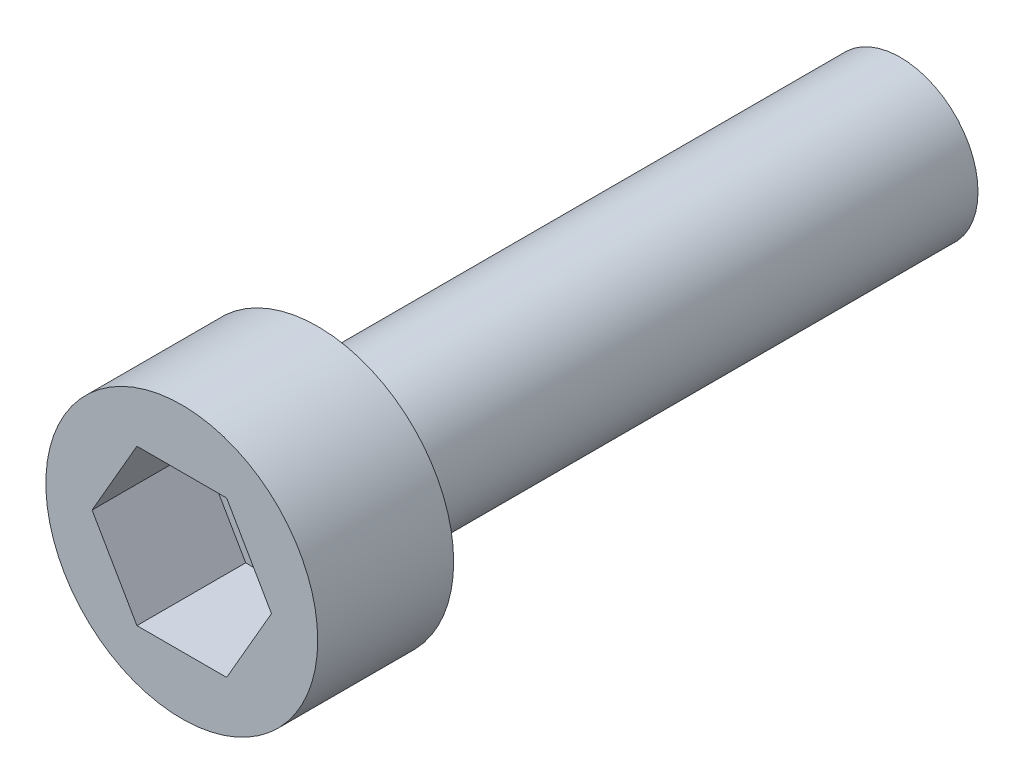
ISO-10303-21;
HEADER;
FILE_DESCRIPTION(('STEP AP214'),'2;1');
FILE_NAME('part.step','',(''),(''),'','','');
FILE_SCHEMA(('AUTOMOTIVE_DESIGN { 1 0 10303 214 1 1 1 1 }'));
ENDSEC;
DATA;
#1=APPLICATION_CONTEXT('core data for automotive mechanical design processes');
#2=APPLICATION_PROTOCOL_DEFINITION('international standard','automotive_design',2000,#1);
#3=PRODUCT_CONTEXT('',#1,'mechanical');
#4=PRODUCT('Part','Part','',(#3));
#5=PRODUCT_RELATED_PRODUCT_CATEGORY('part','',(#4));
#6=PRODUCT_DEFINITION_FORMATION('','',#4);
#7=PRODUCT_DEFINITION_CONTEXT('part definition',#1,'design');
#8=PRODUCT_DEFINITION('design','',#6,#7);
#9=PRODUCT_DEFINITION_SHAPE('','',#8);
#10=(LENGTH_UNIT() NAMED_UNIT(*) SI_UNIT(.MILLI.,.METRE.));
#11=(NAMED_UNIT(*) PLANE_ANGLE_UNIT() SI_UNIT($,.RADIAN.));
#12=(NAMED_UNIT(*) SI_UNIT($,.STERADIAN.) SOLID_ANGLE_UNIT());
#13=UNCERTAINTY_MEASURE_WITH_UNIT(LENGTH_MEASURE(1.E-05),#10,'distance_accuracy_value','');
#14=(GEOMETRIC_REPRESENTATION_CONTEXT(3) GLOBAL_UNCERTAINTY_ASSIGNED_CONTEXT((#13)) GLOBAL_UNIT_ASSIGNED_CONTEXT((#10,
#11,#12)) REPRESENTATION_CONTEXT('',''));
#15=CARTESIAN_POINT('',(0.,0.,0.));
#16=DIRECTION('',(0.,0.,1.));
#17=DIRECTION('',(1.,0.,0.));
#18=AXIS2_PLACEMENT_3D('',#15,#16,#17);
#19=CARTESIAN_POINT('',(0.,0.,3.5));
#20=DIRECTION('',(0.,0.,-1.));
#21=DIRECTION('',(-1.,0.,0.));
#22=AXIS2_PLACEMENT_3D('',#19,#20,#21);
#23=CYLINDRICAL_SURFACE('',#22,3.5);
#24=CARTESIAN_POINT('',(0.,0.,3.5));
#25=DIRECTION('',(0.,0.,1.));
#26=DIRECTION('',(1.,0.,0.));
#27=AXIS2_PLACEMENT_3D('',#24,#25,#26);
#28=CIRCLE('',#27,3.5);
#29=CARTESIAN_POINT('',(3.5,0.,3.5));
#30=VERTEX_POINT('',#29);
#31=EDGE_CURVE('E11',#30,#30,#28,.T.);
#32=ORIENTED_EDGE('',*,*,#31,.F.);
#33=EDGE_LOOP('',(#32));
#34=FACE_BOUND('',#33,.T.);
#35=CARTESIAN_POINT('',(0.,0.,0.));
#36=DIRECTION('',(0.,0.,1.));
#37=DIRECTION('',(1.,0.,0.));
#38=AXIS2_PLACEMENT_3D('',#35,#36,#37);
#39=CIRCLE('',#38,3.5);
#40=CARTESIAN_POINT('',(3.5,0.,0.));
#41=VERTEX_POINT('',#40);
#42=EDGE_CURVE('E36',#41,#41,#39,.T.);
#43=ORIENTED_EDGE('',*,*,#42,.T.);
#44=EDGE_LOOP('',(#43));
#45=FACE_BOUND('',#44,.T.);
#46=ADVANCED_FACE('F33',(#34,#45),#23,.T.);
#47=CARTESIAN_POINT('',(0.,0.,3.5));
#48=DIRECTION('',(0.,0.,1.));
#49=DIRECTION('',(1.,0.,0.));
#50=AXIS2_PLACEMENT_3D('',#47,#48,#49);
#51=PLANE('',#50);
#52=DIRECTION('',(-0.499999999999528,-0.866025403784711,0.));
#53=VECTOR('',#52,1.);
#54=CARTESIAN_POINT('',(-2.30940107675726,2.46370163389215E-12,3.5));
#55=LINE('',#54,#53);
#56=CARTESIAN_POINT('',(-1.1547005383805,2.00000000000066,3.5));
#57=VERTEX_POINT('',#56);
#58=CARTESIAN_POINT('',(-2.30940107675726,2.46352417632156E-12,3.5));
#59=VERTEX_POINT('',#58);
#60=EDGE_CURVE('E47',#57,#59,#55,.T.);
#61=ORIENTED_EDGE('',*,*,#60,.F.);
#62=DIRECTION('',(-1.,-7.11158173176407E-13,0.));
#63=VECTOR('',#62,1.);
#64=CARTESIAN_POINT('',(-1.1547005383805,2.00000000000066,3.5));
#65=LINE('',#64,#63);
#66=CARTESIAN_POINT('',(1.15470053838058,2.00000000000231,3.5));
#67=VERTEX_POINT('',#66);
#68=EDGE_CURVE('E131',#67,#57,#65,.T.);
#69=ORIENTED_EDGE('',*,*,#68,.F.);
#70=DIRECTION('',(-0.500000000000431,0.86602540378419,0.));
#71=VECTOR('',#70,1.);
#72=CARTESIAN_POINT('',(1.15470053838058,2.00000000000231,3.5));
#73=LINE('',#72,#71);
#74=CARTESIAN_POINT('',(2.30940107676107,2.46370163389218E-12,3.5));
#75=VERTEX_POINT('',#74);
#76=EDGE_CURVE('E129',#75,#67,#73,.T.);
#77=ORIENTED_EDGE('',*,*,#76,.F.);
#78=DIRECTION('',(0.499999999999528,0.866025403784711,0.));
#79=VECTOR('',#78,1.);
#80=CARTESIAN_POINT('',(2.30940107676107,2.46370163389218E-12,3.5));
#81=LINE('',#80,#79);
#82=CARTESIAN_POINT('',(1.15470053838058,-2.00000000000219,3.5));
#83=VERTEX_POINT('',#82);
#84=EDGE_CURVE('E95',#83,#75,#81,.T.);
#85=ORIENTED_EDGE('',*,*,#84,.F.);
#86=DIRECTION('',(1.,7.1097038385386E-13,0.));
#87=VECTOR('',#86,1.);
#88=CARTESIAN_POINT('',(1.15470053838058,-2.00000000000219,3.5));
#89=LINE('',#88,#87);
#90=CARTESIAN_POINT('',(-1.15470053837305,-2.00000000000384,3.5));
#91=VERTEX_POINT('',#90);
#92=EDGE_CURVE('E125',#91,#83,#89,.T.);
#93=ORIENTED_EDGE('',*,*,#92,.F.);
#94=DIRECTION('',(0.500000000000431,-0.86602540378419,0.));
#95=VECTOR('',#94,1.);
#96=CARTESIAN_POINT('',(-1.15470053837305,-2.00000000000384,3.5));
#97=LINE('',#96,#95);
#98=EDGE_CURVE('E121',#59,#91,#97,.T.);
#99=ORIENTED_EDGE('',*,*,#98,.F.);
#100=EDGE_LOOP('',(#61,#69,#77,#85,#93,#99));
#101=FACE_BOUND('',#100,.T.);
#102=ORIENTED_EDGE('',*,*,#31,.T.);
#103=EDGE_LOOP('',(#102));
#104=FACE_BOUND('',#103,.T.);
#105=ADVANCED_FACE('F144',(#101,#104),#51,.T.);
#106=CARTESIAN_POINT('',(0.,0.,0.));
#107=DIRECTION('',(0.,0.,1.));
#108=DIRECTION('',(1.,0.,0.));
#109=AXIS2_PLACEMENT_3D('',#106,#107,#108);
#110=PLANE('',#109);
#111=CARTESIAN_POINT('',(0.,0.,0.));
#112=DIRECTION('',(0.,0.,1.));
#113=DIRECTION('',(1.,0.,0.));
#114=AXIS2_PLACEMENT_3D('',#111,#112,#113);
#115=CIRCLE('',#114,2.);
#116=CARTESIAN_POINT('',(2.,0.,0.));
#117=VERTEX_POINT('',#116);
#118=EDGE_CURVE('E151',#117,#117,#115,.T.);
#119=ORIENTED_EDGE('',*,*,#118,.T.);
#120=EDGE_LOOP('',(#119));
#121=FACE_BOUND('',#120,.T.);
#122=ORIENTED_EDGE('',*,*,#42,.F.);
#123=EDGE_LOOP('',(#122));
#124=FACE_BOUND('',#123,.T.);
#125=ADVANCED_FACE('F172',(#121,#124),#110,.F.);
#126=CARTESIAN_POINT('',(-2.30940107675726,2.46370163389215E-12,0.7));
#127=DIRECTION('',(-0.866025403784711,0.499999999999528,0.));
#128=DIRECTION('',(-0.499999999999528,-0.866025403784711,0.));
#129=AXIS2_PLACEMENT_3D('',#126,#127,#128);
#130=PLANE('',#129);
#131=ORIENTED_EDGE('',*,*,#60,.T.);
#132=DIRECTION('',(0.,0.,1.));
#133=VECTOR('',#132,1.);
#134=CARTESIAN_POINT('',(-2.30940107675726,2.46370163389215E-12,0.7));
#135=LINE('',#134,#133);
#136=CARTESIAN_POINT('',(-2.30940107675726,2.46370163389215E-12,0.7));
#137=VERTEX_POINT('',#136);
#138=EDGE_CURVE('E77',#137,#59,#135,.T.);
#139=ORIENTED_EDGE('',*,*,#138,.F.);
#140=DIRECTION('',(-0.499999999999528,-0.866025403784711,0.));
#141=VECTOR('',#140,1.);
#142=CARTESIAN_POINT('',(-2.30940107675726,2.46370163389215E-12,0.7));
#143=LINE('',#142,#141);
#144=CARTESIAN_POINT('',(-1.1547005383805,2.00000000000066,0.7));
#145=VERTEX_POINT('',#144);
#146=EDGE_CURVE('E133',#145,#137,#143,.T.);
#147=ORIENTED_EDGE('',*,*,#146,.F.);
#148=DIRECTION('',(0.,0.,1.));
#149=VECTOR('',#148,1.);
#150=CARTESIAN_POINT('',(-1.1547005383805,2.00000000000066,0.7));
#151=LINE('',#150,#149);
#152=EDGE_CURVE('E55',#145,#57,#151,.T.);
#153=ORIENTED_EDGE('',*,*,#152,.T.);
#154=EDGE_LOOP('',(#131,#139,#147,#153));
#155=FACE_BOUND('',#154,.T.);
#156=ADVANCED_FACE('F180',(#155),#130,.F.);
#157=CARTESIAN_POINT('',(-1.1547005383805,2.00000000000066,0.7));
#158=DIRECTION('',(-7.11158173176407E-13,1.,0.));
#159=DIRECTION('',(-1.,-7.11158173176407E-13,0.));
#160=AXIS2_PLACEMENT_3D('',#157,#158,#159);
#161=PLANE('',#160);
#162=ORIENTED_EDGE('',*,*,#68,.T.);
#163=ORIENTED_EDGE('',*,*,#152,.F.);
#164=DIRECTION('',(-1.,-7.11158173176407E-13,0.));
#165=VECTOR('',#164,1.);
#166=CARTESIAN_POINT('',(-1.1547005383805,2.00000000000066,0.7));
#167=LINE('',#166,#165);
#168=CARTESIAN_POINT('',(1.15470053838058,2.00000000000231,0.7));
#169=VERTEX_POINT('',#168);
#170=EDGE_CURVE('E107',#169,#145,#167,.T.);
#171=ORIENTED_EDGE('',*,*,#170,.F.);
#172=DIRECTION('',(0.,0.,1.));
#173=VECTOR('',#172,1.);
#174=CARTESIAN_POINT('',(1.15470053838058,2.00000000000231,0.7));
#175=LINE('',#174,#173);
#176=EDGE_CURVE('E99',#169,#67,#175,.T.);
#177=ORIENTED_EDGE('',*,*,#176,.T.);
#178=EDGE_LOOP('',(#162,#163,#171,#177));
#179=FACE_BOUND('',#178,.T.);
#180=ADVANCED_FACE('F185',(#179),#161,.F.);
#181=CARTESIAN_POINT('',(1.15470053838058,2.00000000000231,0.7));
#182=DIRECTION('',(0.86602540378419,0.500000000000431,0.));
#183=DIRECTION('',(-0.500000000000431,0.86602540378419,0.));
#184=AXIS2_PLACEMENT_3D('',#181,#182,#183);
#185=PLANE('',#184);
#186=ORIENTED_EDGE('',*,*,#76,.T.);
#187=ORIENTED_EDGE('',*,*,#176,.F.);
#188=DIRECTION('',(-0.500000000000431,0.86602540378419,0.));
#189=VECTOR('',#188,1.);
#190=CARTESIAN_POINT('',(1.15470053838058,2.00000000000231,0.7));
#191=LINE('',#190,#189);
#192=CARTESIAN_POINT('',(2.30940107676107,2.46370163389218E-12,0.7));
#193=VERTEX_POINT('',#192);
#194=EDGE_CURVE('E103',#193,#169,#191,.T.);
#195=ORIENTED_EDGE('',*,*,#194,.F.);
#196=DIRECTION('',(0.,0.,1.));
#197=VECTOR('',#196,1.);
#198=CARTESIAN_POINT('',(2.30940107676107,2.46370163389218E-12,0.7));
#199=LINE('',#198,#197);
#200=EDGE_CURVE('E88',#193,#75,#199,.T.);
#201=ORIENTED_EDGE('',*,*,#200,.T.);
#202=EDGE_LOOP('',(#186,#187,#195,#201));
#203=FACE_BOUND('',#202,.T.);
#204=ADVANCED_FACE('F104',(#203),#185,.F.);
#205=CARTESIAN_POINT('',(2.30940107676107,2.46370163389218E-12,0.7));
#206=DIRECTION('',(0.866025403784711,-0.499999999999528,0.));
#207=DIRECTION('',(0.499999999999528,0.866025403784711,0.));
#208=AXIS2_PLACEMENT_3D('',#205,#206,#207);
#209=PLANE('',#208);
#210=ORIENTED_EDGE('',*,*,#84,.T.);
#211=ORIENTED_EDGE('',*,*,#200,.F.);
#212=DIRECTION('',(0.499999999999528,0.866025403784711,0.));
#213=VECTOR('',#212,1.);
#214=CARTESIAN_POINT('',(2.30940107676107,2.46370163389218E-12,0.7));
#215=LINE('',#214,#213);
#216=CARTESIAN_POINT('',(1.15470053838058,-2.00000000000219,0.7));
#217=VERTEX_POINT('',#216);
#218=EDGE_CURVE('E92',#217,#193,#215,.T.);
#219=ORIENTED_EDGE('',*,*,#218,.F.);
#220=DIRECTION('',(0.,0.,1.));
#221=VECTOR('',#220,1.);
#222=CARTESIAN_POINT('',(1.15470053838058,-2.00000000000219,0.7));
#223=LINE('',#222,#221);
#224=EDGE_CURVE('E100',#217,#83,#223,.T.);
#225=ORIENTED_EDGE('',*,*,#224,.T.);
#226=EDGE_LOOP('',(#210,#211,#219,#225));
#227=FACE_BOUND('',#226,.T.);
#228=ADVANCED_FACE('F90',(#227),#209,.F.);
#229=CARTESIAN_POINT('',(1.15470053838058,-2.00000000000219,0.7));
#230=DIRECTION('',(7.10970383853861E-13,-1.,0.));
#231=DIRECTION('',(1.,7.10970383853861E-13,0.));
#232=AXIS2_PLACEMENT_3D('',#229,#230,#231);
#233=PLANE('',#232);
#234=ORIENTED_EDGE('',*,*,#92,.T.);
#235=ORIENTED_EDGE('',*,*,#224,.F.);
#236=DIRECTION('',(1.,7.1097038385386E-13,0.));
#237=VECTOR('',#236,1.);
#238=CARTESIAN_POINT('',(1.15470053838058,-2.00000000000219,0.7));
#239=LINE('',#238,#237);
#240=CARTESIAN_POINT('',(-1.15470053837305,-2.00000000000384,0.7));
#241=VERTEX_POINT('',#240);
#242=EDGE_CURVE('E113',#241,#217,#239,.T.);
#243=ORIENTED_EDGE('',*,*,#242,.F.);
#244=DIRECTION('',(0.,0.,1.));
#245=VECTOR('',#244,1.);
#246=CARTESIAN_POINT('',(-1.15470053837305,-2.00000000000384,0.7));
#247=LINE('',#246,#245);
#248=EDGE_CURVE('E137',#241,#91,#247,.T.);
#249=ORIENTED_EDGE('',*,*,#248,.T.);
#250=EDGE_LOOP('',(#234,#235,#243,#249));
#251=FACE_BOUND('',#250,.T.);
#252=ADVANCED_FACE('F148',(#251),#233,.F.);
#253=CARTESIAN_POINT('',(-1.15470053837305,-2.00000000000384,0.7));
#254=DIRECTION('',(-0.86602540378419,-0.500000000000431,0.));
#255=DIRECTION('',(0.500000000000431,-0.86602540378419,0.));
#256=AXIS2_PLACEMENT_3D('',#253,#254,#255);
#257=PLANE('',#256);
#258=ORIENTED_EDGE('',*,*,#98,.T.);
#259=ORIENTED_EDGE('',*,*,#248,.F.);
#260=DIRECTION('',(0.500000000000431,-0.86602540378419,0.));
#261=VECTOR('',#260,1.);
#262=CARTESIAN_POINT('',(-1.15470053837305,-2.00000000000384,0.7));
#263=LINE('',#262,#261);
#264=EDGE_CURVE('E115',#137,#241,#263,.T.);
#265=ORIENTED_EDGE('',*,*,#264,.F.);
#266=ORIENTED_EDGE('',*,*,#138,.T.);
#267=EDGE_LOOP('',(#258,#259,#265,#266));
#268=FACE_BOUND('',#267,.T.);
#269=ADVANCED_FACE('F141',(#268),#257,.F.);
#270=CARTESIAN_POINT('',(-1.1547005383805,2.00000000000066,0.7));
#271=DIRECTION('',(0.,0.,-1.));
#272=DIRECTION('',(-1.,0.,0.));
#273=AXIS2_PLACEMENT_3D('',#270,#271,#272);
#274=PLANE('',#273);
#275=ORIENTED_EDGE('',*,*,#146,.T.);
#276=ORIENTED_EDGE('',*,*,#264,.T.);
#277=ORIENTED_EDGE('',*,*,#242,.T.);
#278=ORIENTED_EDGE('',*,*,#218,.T.);
#279=ORIENTED_EDGE('',*,*,#194,.T.);
#280=ORIENTED_EDGE('',*,*,#170,.T.);
#281=EDGE_LOOP('',(#275,#276,#277,#278,#279,#280));
#282=FACE_BOUND('',#281,.T.);
#283=ADVANCED_FACE('F110',(#282),#274,.F.);
#284=CARTESIAN_POINT('',(0.,0.,-15.));
#285=DIRECTION('',(0.,0.,1.));
#286=DIRECTION('',(1.,0.,0.));
#287=AXIS2_PLACEMENT_3D('',#284,#285,#286);
#288=CYLINDRICAL_SURFACE('',#287,2.);
#289=CARTESIAN_POINT('',(0.,0.,-15.));
#290=DIRECTION('',(0.,0.,1.));
#291=DIRECTION('',(1.,0.,0.));
#292=AXIS2_PLACEMENT_3D('',#289,#290,#291);
#293=CIRCLE('',#292,2.);
#294=CARTESIAN_POINT('',(2.,0.,-15.));
#295=VERTEX_POINT('',#294);
#296=EDGE_CURVE('E122',#295,#295,#293,.T.);
#297=ORIENTED_EDGE('',*,*,#296,.T.);
#298=EDGE_LOOP('',(#297));
#299=FACE_BOUND('',#298,.T.);
#300=ORIENTED_EDGE('',*,*,#118,.F.);
#301=EDGE_LOOP('',(#300));
#302=FACE_BOUND('',#301,.T.);
#303=ADVANCED_FACE('F157',(#299,#302),#288,.T.);
#304=CARTESIAN_POINT('',(0.,0.,-15.));
#305=DIRECTION('',(0.,0.,1.));
#306=DIRECTION('',(1.,0.,0.));
#307=AXIS2_PLACEMENT_3D('',#304,#305,#306);
#308=PLANE('',#307);
#309=ORIENTED_EDGE('',*,*,#296,.F.);
#310=EDGE_LOOP('',(#309));
#311=FACE_BOUND('',#310,.T.);
#312=ADVANCED_FACE('F160',(#311),#308,.F.);
#313=CLOSED_SHELL('',(#46,#105,#125,#156,#180,#204,#228,#252,#269,#283,#303,#312));
#314=MANIFOLD_SOLID_BREP('B2',#313);
#315=ADVANCED_BREP_SHAPE_REPRESENTATION('',(#18,#314),#14);
#316=SHAPE_DEFINITION_REPRESENTATION(#9,#315);
ENDSEC;
END-ISO-10303-21;
